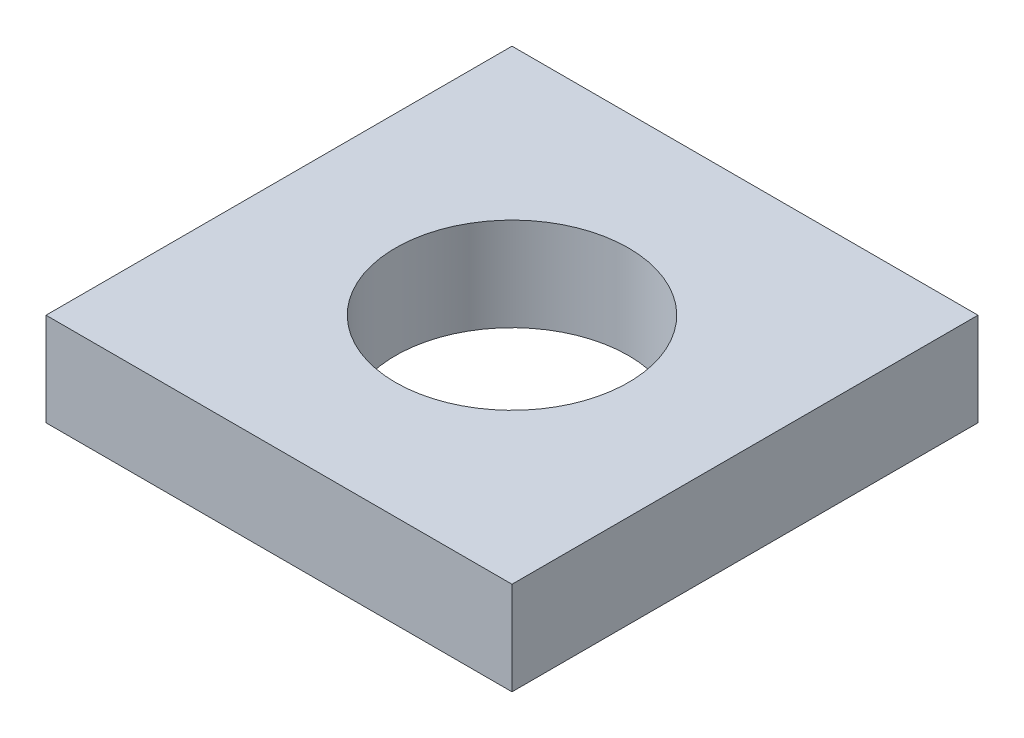
ISO-10303-21;
HEADER;
FILE_DESCRIPTION(('STEP AP214'),'2;1');
FILE_NAME('part.step','',(''),(''),'','','');
FILE_SCHEMA(('AUTOMOTIVE_DESIGN { 1 0 10303 214 1 1 1 1 }'));
ENDSEC;
DATA;
#1=APPLICATION_CONTEXT('core data for automotive mechanical design processes');
#2=APPLICATION_PROTOCOL_DEFINITION('international standard','automotive_design',2000,#1);
#3=PRODUCT_CONTEXT('',#1,'mechanical');
#4=PRODUCT('Part','Part','',(#3));
#5=PRODUCT_RELATED_PRODUCT_CATEGORY('part','',(#4));
#6=PRODUCT_DEFINITION_FORMATION('','',#4);
#7=PRODUCT_DEFINITION_CONTEXT('part definition',#1,'design');
#8=PRODUCT_DEFINITION('design','',#6,#7);
#9=PRODUCT_DEFINITION_SHAPE('','',#8);
#10=(LENGTH_UNIT() NAMED_UNIT(*) SI_UNIT(.MILLI.,.METRE.));
#11=(NAMED_UNIT(*) PLANE_ANGLE_UNIT() SI_UNIT($,.RADIAN.));
#12=(NAMED_UNIT(*) SI_UNIT($,.STERADIAN.) SOLID_ANGLE_UNIT());
#13=UNCERTAINTY_MEASURE_WITH_UNIT(LENGTH_MEASURE(1.E-05),#10,'distance_accuracy_value','');
#14=(GEOMETRIC_REPRESENTATION_CONTEXT(3) GLOBAL_UNCERTAINTY_ASSIGNED_CONTEXT((#13)) GLOBAL_UNIT_ASSIGNED_CONTEXT((#10,
#11,#12)) REPRESENTATION_CONTEXT('',''));
#15=CARTESIAN_POINT('',(0.,0.,0.));
#16=DIRECTION('',(0.,0.,1.));
#17=DIRECTION('',(1.,0.,0.));
#18=AXIS2_PLACEMENT_3D('',#15,#16,#17);
#19=CARTESIAN_POINT('',(0.,2.54,6.35));
#20=DIRECTION('',(0.,0.,-1.));
#21=DIRECTION('',(-1.,0.,0.));
#22=AXIS2_PLACEMENT_3D('',#19,#20,#21);
#23=PLANE('',#22);
#24=DIRECTION('',(1.,0.,0.));
#25=VECTOR('',#24,1.);
#26=CARTESIAN_POINT('',(0.,0.,6.35));
#27=LINE('',#26,#25);
#28=CARTESIAN_POINT('',(-6.35,0.,6.35));
#29=VERTEX_POINT('',#28);
#30=CARTESIAN_POINT('',(6.35,0.,6.35));
#31=VERTEX_POINT('',#30);
#32=EDGE_CURVE('E112',#29,#31,#27,.T.);
#33=ORIENTED_EDGE('',*,*,#32,.T.);
#34=DIRECTION('',(0.,-1.,0.));
#35=VECTOR('',#34,1.);
#36=CARTESIAN_POINT('',(6.35,2.54,6.35));
#37=LINE('',#36,#35);
#38=CARTESIAN_POINT('',(6.35,2.54,6.35));
#39=VERTEX_POINT('',#38);
#40=EDGE_CURVE('E11',#39,#31,#37,.T.);
#41=ORIENTED_EDGE('',*,*,#40,.F.);
#42=DIRECTION('',(1.,0.,0.));
#43=VECTOR('',#42,1.);
#44=CARTESIAN_POINT('',(0.,2.54,6.35));
#45=LINE('',#44,#43);
#46=CARTESIAN_POINT('',(-6.35,2.54,6.35));
#47=VERTEX_POINT('',#46);
#48=EDGE_CURVE('E90',#47,#39,#45,.T.);
#49=ORIENTED_EDGE('',*,*,#48,.F.);
#50=DIRECTION('',(0.,-1.,0.));
#51=VECTOR('',#50,1.);
#52=CARTESIAN_POINT('',(-6.35,2.54,6.35));
#53=LINE('',#52,#51);
#54=EDGE_CURVE('E57',#47,#29,#53,.T.);
#55=ORIENTED_EDGE('',*,*,#54,.T.);
#56=EDGE_LOOP('',(#33,#41,#49,#55));
#57=FACE_BOUND('',#56,.T.);
#58=ADVANCED_FACE('F39',(#57),#23,.F.);
#59=CARTESIAN_POINT('',(6.35,2.54,0.));
#60=DIRECTION('',(-1.,0.,0.));
#61=DIRECTION('',(0.,0.,1.));
#62=AXIS2_PLACEMENT_3D('',#59,#60,#61);
#63=PLANE('',#62);
#64=DIRECTION('',(0.,0.,-1.));
#65=VECTOR('',#64,1.);
#66=CARTESIAN_POINT('',(6.35,0.,0.));
#67=LINE('',#66,#65);
#68=CARTESIAN_POINT('',(6.35,0.,-6.35));
#69=VERTEX_POINT('',#68);
#70=EDGE_CURVE('E96',#31,#69,#67,.T.);
#71=ORIENTED_EDGE('',*,*,#70,.T.);
#72=DIRECTION('',(0.,-1.,0.));
#73=VECTOR('',#72,1.);
#74=CARTESIAN_POINT('',(6.35,2.54,-6.35));
#75=LINE('',#74,#73);
#76=CARTESIAN_POINT('',(6.35,2.54,-6.35));
#77=VERTEX_POINT('',#76);
#78=EDGE_CURVE('E49',#77,#69,#75,.T.);
#79=ORIENTED_EDGE('',*,*,#78,.F.);
#80=DIRECTION('',(0.,0.,-1.));
#81=VECTOR('',#80,1.);
#82=CARTESIAN_POINT('',(6.35,2.54,0.));
#83=LINE('',#82,#81);
#84=EDGE_CURVE('E82',#39,#77,#83,.T.);
#85=ORIENTED_EDGE('',*,*,#84,.F.);
#86=ORIENTED_EDGE('',*,*,#40,.T.);
#87=EDGE_LOOP('',(#71,#79,#85,#86));
#88=FACE_BOUND('',#87,.T.);
#89=ADVANCED_FACE('F95',(#88),#63,.F.);
#90=CARTESIAN_POINT('',(0.,2.54,-6.35));
#91=DIRECTION('',(0.,0.,-1.));
#92=DIRECTION('',(-1.,0.,0.));
#93=AXIS2_PLACEMENT_3D('',#90,#91,#92);
#94=PLANE('',#93);
#95=DIRECTION('',(1.,0.,0.));
#96=VECTOR('',#95,1.);
#97=CARTESIAN_POINT('',(0.,0.,-6.35));
#98=LINE('',#97,#96);
#99=CARTESIAN_POINT('',(-6.35,0.,-6.35));
#100=VERTEX_POINT('',#99);
#101=EDGE_CURVE('E117',#100,#69,#98,.T.);
#102=ORIENTED_EDGE('',*,*,#101,.F.);
#103=DIRECTION('',(0.,-1.,0.));
#104=VECTOR('',#103,1.);
#105=CARTESIAN_POINT('',(-6.35,2.54,-6.35));
#106=LINE('',#105,#104);
#107=CARTESIAN_POINT('',(-6.35,2.54,-6.35));
#108=VERTEX_POINT('',#107);
#109=EDGE_CURVE('E71',#108,#100,#106,.T.);
#110=ORIENTED_EDGE('',*,*,#109,.F.);
#111=DIRECTION('',(1.,0.,0.));
#112=VECTOR('',#111,1.);
#113=CARTESIAN_POINT('',(0.,2.54,-6.35));
#114=LINE('',#113,#112);
#115=EDGE_CURVE('E89',#108,#77,#114,.T.);
#116=ORIENTED_EDGE('',*,*,#115,.T.);
#117=ORIENTED_EDGE('',*,*,#78,.T.);
#118=EDGE_LOOP('',(#102,#110,#116,#117));
#119=FACE_BOUND('',#118,.T.);
#120=ADVANCED_FACE('F100',(#119),#94,.T.);
#121=CARTESIAN_POINT('',(0.,2.54,0.));
#122=DIRECTION('',(0.,-1.,0.));
#123=DIRECTION('',(0.,0.,-1.));
#124=AXIS2_PLACEMENT_3D('',#121,#122,#123);
#125=CYLINDRICAL_SURFACE('',#124,3.175);
#126=CARTESIAN_POINT('',(0.,2.54,0.));
#127=DIRECTION('',(0.,1.,0.));
#128=DIRECTION('',(0.,0.,1.));
#129=AXIS2_PLACEMENT_3D('',#126,#127,#128);
#130=CIRCLE('',#129,3.175);
#131=CARTESIAN_POINT('',(0.,2.54,3.175));
#132=VERTEX_POINT('',#131);
#133=EDGE_CURVE('E124',#132,#132,#130,.T.);
#134=ORIENTED_EDGE('',*,*,#133,.T.);
#135=EDGE_LOOP('',(#134));
#136=FACE_BOUND('',#135,.T.);
#137=CARTESIAN_POINT('',(0.,0.,0.));
#138=DIRECTION('',(0.,1.,0.));
#139=DIRECTION('',(0.,0.,1.));
#140=AXIS2_PLACEMENT_3D('',#137,#138,#139);
#141=CIRCLE('',#140,3.175);
#142=CARTESIAN_POINT('',(0.,0.,3.175));
#143=VERTEX_POINT('',#142);
#144=EDGE_CURVE('E108',#143,#143,#141,.T.);
#145=ORIENTED_EDGE('',*,*,#144,.F.);
#146=EDGE_LOOP('',(#145));
#147=FACE_BOUND('',#146,.T.);
#148=ADVANCED_FACE('F41',(#136,#147),#125,.F.);
#149=CARTESIAN_POINT('',(-6.35,2.54,0.));
#150=DIRECTION('',(-1.,0.,0.));
#151=DIRECTION('',(0.,0.,1.));
#152=AXIS2_PLACEMENT_3D('',#149,#150,#151);
#153=PLANE('',#152);
#154=DIRECTION('',(0.,0.,-1.));
#155=VECTOR('',#154,1.);
#156=CARTESIAN_POINT('',(-6.35,0.,0.));
#157=LINE('',#156,#155);
#158=EDGE_CURVE('E120',#29,#100,#157,.T.);
#159=ORIENTED_EDGE('',*,*,#158,.F.);
#160=ORIENTED_EDGE('',*,*,#54,.F.);
#161=DIRECTION('',(0.,0.,-1.));
#162=VECTOR('',#161,1.);
#163=CARTESIAN_POINT('',(-6.35,2.54,0.));
#164=LINE('',#163,#162);
#165=EDGE_CURVE('E102',#47,#108,#164,.T.);
#166=ORIENTED_EDGE('',*,*,#165,.T.);
#167=ORIENTED_EDGE('',*,*,#109,.T.);
#168=EDGE_LOOP('',(#159,#160,#166,#167));
#169=FACE_BOUND('',#168,.T.);
#170=ADVANCED_FACE('F139',(#169),#153,.T.);
#171=CARTESIAN_POINT('',(0.,2.54,0.));
#172=DIRECTION('',(0.,1.,0.));
#173=DIRECTION('',(0.,0.,1.));
#174=AXIS2_PLACEMENT_3D('',#171,#172,#173);
#175=PLANE('',#174);
#176=ORIENTED_EDGE('',*,*,#133,.F.);
#177=EDGE_LOOP('',(#176));
#178=FACE_BOUND('',#177,.T.);
#179=ORIENTED_EDGE('',*,*,#48,.T.);
#180=ORIENTED_EDGE('',*,*,#84,.T.);
#181=ORIENTED_EDGE('',*,*,#115,.F.);
#182=ORIENTED_EDGE('',*,*,#165,.F.);
#183=EDGE_LOOP('',(#179,#180,#181,#182));
#184=FACE_BOUND('',#183,.T.);
#185=ADVANCED_FACE('F86',(#178,#184),#175,.T.);
#186=CARTESIAN_POINT('',(0.,0.,0.));
#187=DIRECTION('',(0.,1.,0.));
#188=DIRECTION('',(0.,0.,1.));
#189=AXIS2_PLACEMENT_3D('',#186,#187,#188);
#190=PLANE('',#189);
#191=ORIENTED_EDGE('',*,*,#144,.T.);
#192=EDGE_LOOP('',(#191));
#193=FACE_BOUND('',#192,.T.);
#194=ORIENTED_EDGE('',*,*,#32,.F.);
#195=ORIENTED_EDGE('',*,*,#158,.T.);
#196=ORIENTED_EDGE('',*,*,#101,.T.);
#197=ORIENTED_EDGE('',*,*,#70,.F.);
#198=EDGE_LOOP('',(#194,#195,#196,#197));
#199=FACE_BOUND('',#198,.T.);
#200=ADVANCED_FACE('F138',(#193,#199),#190,.F.);
#201=CLOSED_SHELL('',(#58,#89,#120,#148,#170,#185,#200));
#202=MANIFOLD_SOLID_BREP('B2',#201);
#203=ADVANCED_BREP_SHAPE_REPRESENTATION('',(#18,#202),#14);
#204=SHAPE_DEFINITION_REPRESENTATION(#9,#203);
ENDSEC;
END-ISO-10303-21;
